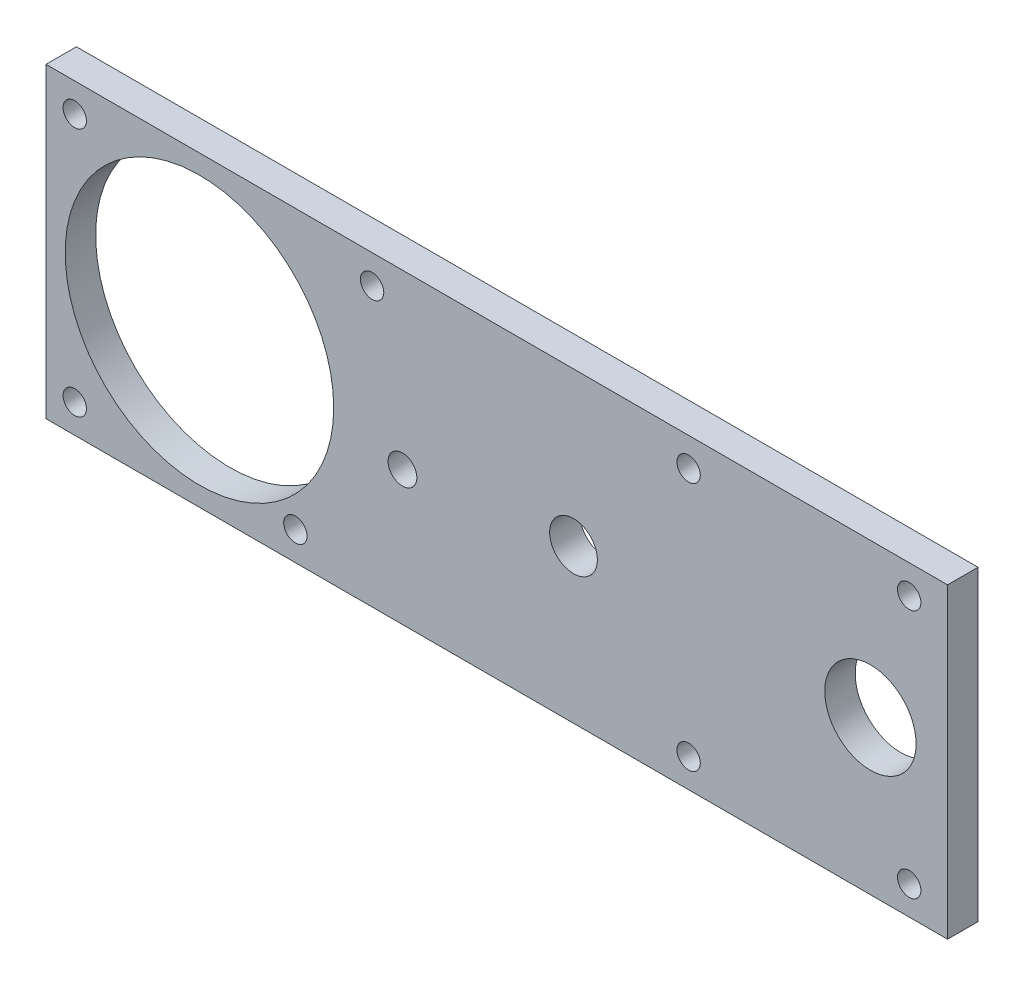
ISO-10303-21;
HEADER;
FILE_DESCRIPTION(('STEP AP214'),'2;1');
FILE_NAME('part.step','',(''),(''),'','','');
FILE_SCHEMA(('AUTOMOTIVE_DESIGN { 1 0 10303 214 1 1 1 1 }'));
ENDSEC;
DATA;
#1=APPLICATION_CONTEXT('core data for automotive mechanical design processes');
#2=APPLICATION_PROTOCOL_DEFINITION('international standard','automotive_design',2000,#1);
#3=PRODUCT_CONTEXT('',#1,'mechanical');
#4=PRODUCT('Part','Part','',(#3));
#5=PRODUCT_RELATED_PRODUCT_CATEGORY('part','',(#4));
#6=PRODUCT_DEFINITION_FORMATION('','',#4);
#7=PRODUCT_DEFINITION_CONTEXT('part definition',#1,'design');
#8=PRODUCT_DEFINITION('design','',#6,#7);
#9=PRODUCT_DEFINITION_SHAPE('','',#8);
#10=(LENGTH_UNIT() NAMED_UNIT(*) SI_UNIT(.MILLI.,.METRE.));
#11=(NAMED_UNIT(*) PLANE_ANGLE_UNIT() SI_UNIT($,.RADIAN.));
#12=(NAMED_UNIT(*) SI_UNIT($,.STERADIAN.) SOLID_ANGLE_UNIT());
#13=UNCERTAINTY_MEASURE_WITH_UNIT(LENGTH_MEASURE(1.E-05),#10,'distance_accuracy_value','');
#14=(GEOMETRIC_REPRESENTATION_CONTEXT(3) GLOBAL_UNCERTAINTY_ASSIGNED_CONTEXT((#13)) GLOBAL_UNIT_ASSIGNED_CONTEXT((#10,
#11,#12)) REPRESENTATION_CONTEXT('',''));
#15=CARTESIAN_POINT('',(0.,0.,0.));
#16=DIRECTION('',(0.,0.,1.));
#17=DIRECTION('',(1.,0.,0.));
#18=AXIS2_PLACEMENT_3D('',#15,#16,#17);
#19=CARTESIAN_POINT('',(0.,0.,3.175));
#20=DIRECTION('',(0.,0.,-1.));
#21=DIRECTION('',(-1.,0.,0.));
#22=AXIS2_PLACEMENT_3D('',#19,#20,#21);
#23=PLANE('',#22);
#24=CARTESIAN_POINT('',(85.9562,16.,3.175));
#25=DIRECTION('',(0.,0.,1.));
#26=DIRECTION('',(1.,0.,0.));
#27=AXIS2_PLACEMENT_3D('',#24,#25,#26);
#28=CIRCLE('',#27,4.7625);
#29=CARTESIAN_POINT('',(90.7187,16.,3.175));
#30=VERTEX_POINT('',#29);
#31=EDGE_CURVE('E178',#30,#30,#28,.T.);
#32=ORIENTED_EDGE('',*,*,#31,.F.);
#33=EDGE_LOOP('',(#32));
#34=FACE_BOUND('',#33,.T.);
#35=CARTESIAN_POINT('',(90.,3.,3.175));
#36=DIRECTION('',(0.,0.,1.));
#37=DIRECTION('',(1.,0.,0.));
#38=AXIS2_PLACEMENT_3D('',#35,#36,#37);
#39=CIRCLE('',#38,1.2192);
#40=CARTESIAN_POINT('',(91.2192,3.,3.175));
#41=VERTEX_POINT('',#40);
#42=EDGE_CURVE('E174',#41,#41,#39,.T.);
#43=ORIENTED_EDGE('',*,*,#42,.F.);
#44=EDGE_LOOP('',(#43));
#45=FACE_BOUND('',#44,.T.);
#46=CARTESIAN_POINT('',(90.,29.,3.175));
#47=DIRECTION('',(0.,0.,1.));
#48=DIRECTION('',(1.,0.,0.));
#49=AXIS2_PLACEMENT_3D('',#46,#47,#48);
#50=CIRCLE('',#49,1.2192);
#51=CARTESIAN_POINT('',(91.2192,29.,3.175));
#52=VERTEX_POINT('',#51);
#53=EDGE_CURVE('E168',#52,#52,#50,.T.);
#54=ORIENTED_EDGE('',*,*,#53,.F.);
#55=EDGE_LOOP('',(#54));
#56=FACE_BOUND('',#55,.T.);
#57=CARTESIAN_POINT('',(3.,29.,3.175));
#58=DIRECTION('',(0.,0.,1.));
#59=DIRECTION('',(1.,0.,0.));
#60=AXIS2_PLACEMENT_3D('',#57,#58,#59);
#61=CIRCLE('',#60,1.2192);
#62=CARTESIAN_POINT('',(4.2192,29.,3.175));
#63=VERTEX_POINT('',#62);
#64=EDGE_CURVE('E162',#63,#63,#61,.T.);
#65=ORIENTED_EDGE('',*,*,#64,.F.);
#66=EDGE_LOOP('',(#65));
#67=FACE_BOUND('',#66,.T.);
#68=CARTESIAN_POINT('',(3.,3.,3.175));
#69=DIRECTION('',(0.,0.,1.));
#70=DIRECTION('',(1.,0.,0.));
#71=AXIS2_PLACEMENT_3D('',#68,#69,#70);
#72=CIRCLE('',#71,1.2192);
#73=CARTESIAN_POINT('',(4.2192,3.,3.175));
#74=VERTEX_POINT('',#73);
#75=EDGE_CURVE('E156',#74,#74,#72,.T.);
#76=ORIENTED_EDGE('',*,*,#75,.F.);
#77=EDGE_LOOP('',(#76));
#78=FACE_BOUND('',#77,.T.);
#79=CARTESIAN_POINT('',(34.,29.,3.175));
#80=DIRECTION('',(0.,0.,1.));
#81=DIRECTION('',(1.,0.,0.));
#82=AXIS2_PLACEMENT_3D('',#79,#80,#81);
#83=CIRCLE('',#82,1.2192);
#84=CARTESIAN_POINT('',(35.2192,29.,3.175));
#85=VERTEX_POINT('',#84);
#86=EDGE_CURVE('E150',#85,#85,#83,.T.);
#87=ORIENTED_EDGE('',*,*,#86,.F.);
#88=EDGE_LOOP('',(#87));
#89=FACE_BOUND('',#88,.T.);
#90=CARTESIAN_POINT('',(26.,3.,3.175));
#91=DIRECTION('',(0.,0.,1.));
#92=DIRECTION('',(1.,0.,0.));
#93=AXIS2_PLACEMENT_3D('',#90,#91,#92);
#94=CIRCLE('',#93,1.2192);
#95=CARTESIAN_POINT('',(27.2192,3.,3.175));
#96=VERTEX_POINT('',#95);
#97=EDGE_CURVE('E144',#96,#96,#94,.T.);
#98=ORIENTED_EDGE('',*,*,#97,.F.);
#99=EDGE_LOOP('',(#98));
#100=FACE_BOUND('',#99,.T.);
#101=CARTESIAN_POINT('',(67.,3.,3.175));
#102=DIRECTION('',(0.,0.,1.));
#103=DIRECTION('',(1.,0.,0.));
#104=AXIS2_PLACEMENT_3D('',#101,#102,#103);
#105=CIRCLE('',#104,1.2192);
#106=CARTESIAN_POINT('',(68.2192,3.,3.175));
#107=VERTEX_POINT('',#106);
#108=EDGE_CURVE('E138',#107,#107,#105,.T.);
#109=ORIENTED_EDGE('',*,*,#108,.F.);
#110=EDGE_LOOP('',(#109));
#111=FACE_BOUND('',#110,.T.);
#112=CARTESIAN_POINT('',(67.,29.,3.175));
#113=DIRECTION('',(0.,0.,1.));
#114=DIRECTION('',(1.,0.,0.));
#115=AXIS2_PLACEMENT_3D('',#112,#113,#114);
#116=CIRCLE('',#115,1.2192);
#117=CARTESIAN_POINT('',(68.2192,29.,3.175));
#118=VERTEX_POINT('',#117);
#119=EDGE_CURVE('E132',#118,#118,#116,.T.);
#120=ORIENTED_EDGE('',*,*,#119,.F.);
#121=EDGE_LOOP('',(#120));
#122=FACE_BOUND('',#121,.T.);
#123=CARTESIAN_POINT('',(37.1666992956996,14.,3.175));
#124=DIRECTION('',(0.,0.,1.));
#125=DIRECTION('',(1.,0.,0.));
#126=AXIS2_PLACEMENT_3D('',#123,#124,#125);
#127=CIRCLE('',#126,1.49860000000001);
#128=CARTESIAN_POINT('',(38.6652992956997,14.,3.175));
#129=VERTEX_POINT('',#128);
#130=EDGE_CURVE('E115',#129,#129,#127,.T.);
#131=ORIENTED_EDGE('',*,*,#130,.F.);
#132=EDGE_LOOP('',(#131));
#133=FACE_BOUND('',#132,.T.);
#134=DIRECTION('',(0.,-1.,0.));
#135=VECTOR('',#134,1.);
#136=CARTESIAN_POINT('',(0.,0.,3.175));
#137=LINE('',#136,#135);
#138=CARTESIAN_POINT('',(0.,32.,3.175));
#139=VERTEX_POINT('',#138);
#140=CARTESIAN_POINT('',(0.,0.,3.175));
#141=VERTEX_POINT('',#140);
#142=EDGE_CURVE('E85',#139,#141,#137,.T.);
#143=ORIENTED_EDGE('',*,*,#142,.T.);
#144=DIRECTION('',(1.,0.,0.));
#145=VECTOR('',#144,1.);
#146=CARTESIAN_POINT('',(0.,0.,3.175));
#147=LINE('',#146,#145);
#148=CARTESIAN_POINT('',(93.9999999599999,0.,3.175));
#149=VERTEX_POINT('',#148);
#150=EDGE_CURVE('E80',#141,#149,#147,.T.);
#151=ORIENTED_EDGE('',*,*,#150,.T.);
#152=DIRECTION('',(0.,1.,0.));
#153=VECTOR('',#152,1.);
#154=CARTESIAN_POINT('',(93.9999999599999,0.,3.175));
#155=LINE('',#154,#153);
#156=CARTESIAN_POINT('',(93.9999999599999,32.,3.175));
#157=VERTEX_POINT('',#156);
#158=EDGE_CURVE('E83',#149,#157,#155,.T.);
#159=ORIENTED_EDGE('',*,*,#158,.T.);
#160=DIRECTION('',(-1.,0.,0.));
#161=VECTOR('',#160,1.);
#162=CARTESIAN_POINT('',(0.,32.,3.175));
#163=LINE('',#162,#161);
#164=EDGE_CURVE('E50',#157,#139,#163,.T.);
#165=ORIENTED_EDGE('',*,*,#164,.T.);
#166=EDGE_LOOP('',(#143,#151,#159,#165));
#167=FACE_BOUND('',#166,.T.);
#168=CARTESIAN_POINT('',(55.,16.,3.175));
#169=DIRECTION('',(0.,0.,1.));
#170=DIRECTION('',(1.,0.,0.));
#171=AXIS2_PLACEMENT_3D('',#168,#169,#170);
#172=CIRCLE('',#171,2.4892);
#173=CARTESIAN_POINT('',(57.4892,16.,3.175));
#174=VERTEX_POINT('',#173);
#175=EDGE_CURVE('E100',#174,#174,#172,.T.);
#176=ORIENTED_EDGE('',*,*,#175,.F.);
#177=EDGE_LOOP('',(#176));
#178=FACE_BOUND('',#177,.T.);
#179=CARTESIAN_POINT('',(16.,16.,3.175));
#180=DIRECTION('',(0.,0.,1.));
#181=DIRECTION('',(1.,0.,0.));
#182=AXIS2_PLACEMENT_3D('',#179,#180,#181);
#183=CIRCLE('',#182,14.);
#184=CARTESIAN_POINT('',(30.,16.,3.175));
#185=VERTEX_POINT('',#184);
#186=EDGE_CURVE('E121',#185,#185,#183,.T.);
#187=ORIENTED_EDGE('',*,*,#186,.F.);
#188=EDGE_LOOP('',(#187));
#189=FACE_BOUND('',#188,.T.);
#190=ADVANCED_FACE('F33',(#34,#45,#56,#67,#78,#89,#100,#111,#122,#133,#167,#178,#189),#23,.F.);
#191=CARTESIAN_POINT('',(0.,0.,0.));
#192=DIRECTION('',(0.,0.,-1.));
#193=DIRECTION('',(-1.,0.,0.));
#194=AXIS2_PLACEMENT_3D('',#191,#192,#193);
#195=PLANE('',#194);
#196=CARTESIAN_POINT('',(85.9562,16.,0.));
#197=DIRECTION('',(0.,0.,1.));
#198=DIRECTION('',(1.,0.,0.));
#199=AXIS2_PLACEMENT_3D('',#196,#197,#198);
#200=CIRCLE('',#199,4.7625);
#201=CARTESIAN_POINT('',(90.7187,16.,0.));
#202=VERTEX_POINT('',#201);
#203=EDGE_CURVE('E177',#202,#202,#200,.T.);
#204=ORIENTED_EDGE('',*,*,#203,.T.);
#205=EDGE_LOOP('',(#204));
#206=FACE_BOUND('',#205,.T.);
#207=CARTESIAN_POINT('',(90.,3.,0.));
#208=DIRECTION('',(0.,0.,1.));
#209=DIRECTION('',(1.,0.,0.));
#210=AXIS2_PLACEMENT_3D('',#207,#208,#209);
#211=CIRCLE('',#210,1.2192);
#212=CARTESIAN_POINT('',(91.2192,3.,0.));
#213=VERTEX_POINT('',#212);
#214=EDGE_CURVE('E171',#213,#213,#211,.T.);
#215=ORIENTED_EDGE('',*,*,#214,.T.);
#216=EDGE_LOOP('',(#215));
#217=FACE_BOUND('',#216,.T.);
#218=CARTESIAN_POINT('',(90.,29.,0.));
#219=DIRECTION('',(0.,0.,1.));
#220=DIRECTION('',(1.,0.,0.));
#221=AXIS2_PLACEMENT_3D('',#218,#219,#220);
#222=CIRCLE('',#221,1.2192);
#223=CARTESIAN_POINT('',(91.2192,29.,0.));
#224=VERTEX_POINT('',#223);
#225=EDGE_CURVE('E165',#224,#224,#222,.T.);
#226=ORIENTED_EDGE('',*,*,#225,.T.);
#227=EDGE_LOOP('',(#226));
#228=FACE_BOUND('',#227,.T.);
#229=CARTESIAN_POINT('',(3.,29.,0.));
#230=DIRECTION('',(0.,0.,1.));
#231=DIRECTION('',(1.,0.,0.));
#232=AXIS2_PLACEMENT_3D('',#229,#230,#231);
#233=CIRCLE('',#232,1.2192);
#234=CARTESIAN_POINT('',(4.2192,29.,0.));
#235=VERTEX_POINT('',#234);
#236=EDGE_CURVE('E159',#235,#235,#233,.T.);
#237=ORIENTED_EDGE('',*,*,#236,.T.);
#238=EDGE_LOOP('',(#237));
#239=FACE_BOUND('',#238,.T.);
#240=CARTESIAN_POINT('',(3.,3.,0.));
#241=DIRECTION('',(0.,0.,1.));
#242=DIRECTION('',(1.,0.,0.));
#243=AXIS2_PLACEMENT_3D('',#240,#241,#242);
#244=CIRCLE('',#243,1.2192);
#245=CARTESIAN_POINT('',(4.2192,3.,0.));
#246=VERTEX_POINT('',#245);
#247=EDGE_CURVE('E153',#246,#246,#244,.T.);
#248=ORIENTED_EDGE('',*,*,#247,.T.);
#249=EDGE_LOOP('',(#248));
#250=FACE_BOUND('',#249,.T.);
#251=CARTESIAN_POINT('',(34.,29.,0.));
#252=DIRECTION('',(0.,0.,1.));
#253=DIRECTION('',(1.,0.,0.));
#254=AXIS2_PLACEMENT_3D('',#251,#252,#253);
#255=CIRCLE('',#254,1.2192);
#256=CARTESIAN_POINT('',(35.2192,29.,0.));
#257=VERTEX_POINT('',#256);
#258=EDGE_CURVE('E147',#257,#257,#255,.T.);
#259=ORIENTED_EDGE('',*,*,#258,.T.);
#260=EDGE_LOOP('',(#259));
#261=FACE_BOUND('',#260,.T.);
#262=CARTESIAN_POINT('',(26.,3.,0.));
#263=DIRECTION('',(0.,0.,1.));
#264=DIRECTION('',(1.,0.,0.));
#265=AXIS2_PLACEMENT_3D('',#262,#263,#264);
#266=CIRCLE('',#265,1.2192);
#267=CARTESIAN_POINT('',(27.2192,3.,0.));
#268=VERTEX_POINT('',#267);
#269=EDGE_CURVE('E141',#268,#268,#266,.T.);
#270=ORIENTED_EDGE('',*,*,#269,.T.);
#271=EDGE_LOOP('',(#270));
#272=FACE_BOUND('',#271,.T.);
#273=CARTESIAN_POINT('',(67.,3.,0.));
#274=DIRECTION('',(0.,0.,1.));
#275=DIRECTION('',(1.,0.,0.));
#276=AXIS2_PLACEMENT_3D('',#273,#274,#275);
#277=CIRCLE('',#276,1.2192);
#278=CARTESIAN_POINT('',(68.2192,3.,0.));
#279=VERTEX_POINT('',#278);
#280=EDGE_CURVE('E135',#279,#279,#277,.T.);
#281=ORIENTED_EDGE('',*,*,#280,.T.);
#282=EDGE_LOOP('',(#281));
#283=FACE_BOUND('',#282,.T.);
#284=CARTESIAN_POINT('',(67.,29.,0.));
#285=DIRECTION('',(0.,0.,1.));
#286=DIRECTION('',(1.,0.,0.));
#287=AXIS2_PLACEMENT_3D('',#284,#285,#286);
#288=CIRCLE('',#287,1.2192);
#289=CARTESIAN_POINT('',(68.2192,29.,0.));
#290=VERTEX_POINT('',#289);
#291=EDGE_CURVE('E127',#290,#290,#288,.T.);
#292=ORIENTED_EDGE('',*,*,#291,.T.);
#293=EDGE_LOOP('',(#292));
#294=FACE_BOUND('',#293,.T.);
#295=CARTESIAN_POINT('',(37.1666992956996,14.,0.));
#296=DIRECTION('',(0.,0.,1.));
#297=DIRECTION('',(1.,0.,0.));
#298=AXIS2_PLACEMENT_3D('',#295,#296,#297);
#299=CIRCLE('',#298,1.49860000000001);
#300=CARTESIAN_POINT('',(38.6652992956997,14.,0.));
#301=VERTEX_POINT('',#300);
#302=EDGE_CURVE('E118',#301,#301,#299,.T.);
#303=ORIENTED_EDGE('',*,*,#302,.T.);
#304=EDGE_LOOP('',(#303));
#305=FACE_BOUND('',#304,.T.);
#306=DIRECTION('',(0.,-1.,0.));
#307=VECTOR('',#306,1.);
#308=CARTESIAN_POINT('',(0.,0.,0.));
#309=LINE('',#308,#307);
#310=CARTESIAN_POINT('',(0.,32.,0.));
#311=VERTEX_POINT('',#310);
#312=CARTESIAN_POINT('',(0.,0.,0.));
#313=VERTEX_POINT('',#312);
#314=EDGE_CURVE('E97',#311,#313,#309,.T.);
#315=ORIENTED_EDGE('',*,*,#314,.F.);
#316=DIRECTION('',(-1.,0.,0.));
#317=VECTOR('',#316,1.);
#318=CARTESIAN_POINT('',(0.,32.,0.));
#319=LINE('',#318,#317);
#320=CARTESIAN_POINT('',(93.9999999599999,32.,0.));
#321=VERTEX_POINT('',#320);
#322=EDGE_CURVE('E73',#321,#311,#319,.T.);
#323=ORIENTED_EDGE('',*,*,#322,.F.);
#324=DIRECTION('',(0.,1.,0.));
#325=VECTOR('',#324,1.);
#326=CARTESIAN_POINT('',(93.9999999599999,0.,0.));
#327=LINE('',#326,#325);
#328=CARTESIAN_POINT('',(93.9999999599999,0.,0.));
#329=VERTEX_POINT('',#328);
#330=EDGE_CURVE('E67',#329,#321,#327,.T.);
#331=ORIENTED_EDGE('',*,*,#330,.F.);
#332=DIRECTION('',(1.,0.,0.));
#333=VECTOR('',#332,1.);
#334=CARTESIAN_POINT('',(0.,0.,0.));
#335=LINE('',#334,#333);
#336=EDGE_CURVE('E89',#313,#329,#335,.T.);
#337=ORIENTED_EDGE('',*,*,#336,.F.);
#338=EDGE_LOOP('',(#315,#323,#331,#337));
#339=FACE_BOUND('',#338,.T.);
#340=CARTESIAN_POINT('',(55.,16.,0.));
#341=DIRECTION('',(0.,0.,1.));
#342=DIRECTION('',(1.,0.,0.));
#343=AXIS2_PLACEMENT_3D('',#340,#341,#342);
#344=CIRCLE('',#343,2.4892);
#345=CARTESIAN_POINT('',(57.4892,16.,0.));
#346=VERTEX_POINT('',#345);
#347=EDGE_CURVE('E112',#346,#346,#344,.T.);
#348=ORIENTED_EDGE('',*,*,#347,.T.);
#349=EDGE_LOOP('',(#348));
#350=FACE_BOUND('',#349,.T.);
#351=CARTESIAN_POINT('',(16.,16.,0.));
#352=DIRECTION('',(0.,0.,1.));
#353=DIRECTION('',(1.,0.,0.));
#354=AXIS2_PLACEMENT_3D('',#351,#352,#353);
#355=CIRCLE('',#354,14.);
#356=CARTESIAN_POINT('',(30.,16.,0.));
#357=VERTEX_POINT('',#356);
#358=EDGE_CURVE('E124',#357,#357,#355,.T.);
#359=ORIENTED_EDGE('',*,*,#358,.T.);
#360=EDGE_LOOP('',(#359));
#361=FACE_BOUND('',#360,.T.);
#362=ADVANCED_FACE('F108',(#206,#217,#228,#239,#250,#261,#272,#283,#294,#305,#339,#350,#361),
#195,.T.);
#363=CARTESIAN_POINT('',(0.,0.,3.175));
#364=DIRECTION('',(1.,0.,0.));
#365=DIRECTION('',(0.,1.,0.));
#366=AXIS2_PLACEMENT_3D('',#363,#364,#365);
#367=PLANE('',#366);
#368=ORIENTED_EDGE('',*,*,#314,.T.);
#369=DIRECTION('',(0.,0.,-1.));
#370=VECTOR('',#369,1.);
#371=CARTESIAN_POINT('',(0.,0.,3.175));
#372=LINE('',#371,#370);
#373=EDGE_CURVE('E11',#141,#313,#372,.T.);
#374=ORIENTED_EDGE('',*,*,#373,.F.);
#375=ORIENTED_EDGE('',*,*,#142,.F.);
#376=DIRECTION('',(0.,0.,-1.));
#377=VECTOR('',#376,1.);
#378=CARTESIAN_POINT('',(0.,32.,3.175));
#379=LINE('',#378,#377);
#380=EDGE_CURVE('E93',#139,#311,#379,.T.);
#381=ORIENTED_EDGE('',*,*,#380,.T.);
#382=EDGE_LOOP('',(#368,#374,#375,#381));
#383=FACE_BOUND('',#382,.T.);
#384=ADVANCED_FACE('F35',(#383),#367,.F.);
#385=CARTESIAN_POINT('',(0.,0.,3.175));
#386=DIRECTION('',(0.,1.,0.));
#387=DIRECTION('',(0.,0.,1.));
#388=AXIS2_PLACEMENT_3D('',#385,#386,#387);
#389=PLANE('',#388);
#390=ORIENTED_EDGE('',*,*,#336,.T.);
#391=DIRECTION('',(0.,0.,-1.));
#392=VECTOR('',#391,1.);
#393=CARTESIAN_POINT('',(93.9999999599999,0.,3.175));
#394=LINE('',#393,#392);
#395=EDGE_CURVE('E42',#149,#329,#394,.T.);
#396=ORIENTED_EDGE('',*,*,#395,.F.);
#397=ORIENTED_EDGE('',*,*,#150,.F.);
#398=ORIENTED_EDGE('',*,*,#373,.T.);
#399=EDGE_LOOP('',(#390,#396,#397,#398));
#400=FACE_BOUND('',#399,.T.);
#401=ADVANCED_FACE('F88',(#400),#389,.F.);
#402=CARTESIAN_POINT('',(93.9999999599999,0.,3.175));
#403=DIRECTION('',(-1.,0.,0.));
#404=DIRECTION('',(0.,0.,1.));
#405=AXIS2_PLACEMENT_3D('',#402,#403,#404);
#406=PLANE('',#405);
#407=ORIENTED_EDGE('',*,*,#330,.T.);
#408=DIRECTION('',(0.,0.,-1.));
#409=VECTOR('',#408,1.);
#410=CARTESIAN_POINT('',(93.9999999599999,32.,3.175));
#411=LINE('',#410,#409);
#412=EDGE_CURVE('E90',#157,#321,#411,.T.);
#413=ORIENTED_EDGE('',*,*,#412,.F.);
#414=ORIENTED_EDGE('',*,*,#158,.F.);
#415=ORIENTED_EDGE('',*,*,#395,.T.);
#416=EDGE_LOOP('',(#407,#413,#414,#415));
#417=FACE_BOUND('',#416,.T.);
#418=ADVANCED_FACE('F91',(#417),#406,.F.);
#419=CARTESIAN_POINT('',(0.,32.,3.175));
#420=DIRECTION('',(0.,-1.,0.));
#421=DIRECTION('',(1.,0.,0.));
#422=AXIS2_PLACEMENT_3D('',#419,#420,#421);
#423=PLANE('',#422);
#424=ORIENTED_EDGE('',*,*,#322,.T.);
#425=ORIENTED_EDGE('',*,*,#380,.F.);
#426=ORIENTED_EDGE('',*,*,#164,.F.);
#427=ORIENTED_EDGE('',*,*,#412,.T.);
#428=EDGE_LOOP('',(#424,#425,#426,#427));
#429=FACE_BOUND('',#428,.T.);
#430=ADVANCED_FACE('F105',(#429),#423,.F.);
#431=CARTESIAN_POINT('',(55.,16.,3.175));
#432=DIRECTION('',(0.,0.,-1.));
#433=DIRECTION('',(-1.,0.,0.));
#434=AXIS2_PLACEMENT_3D('',#431,#432,#433);
#435=CYLINDRICAL_SURFACE('',#434,2.4892);
#436=ORIENTED_EDGE('',*,*,#175,.T.);
#437=EDGE_LOOP('',(#436));
#438=FACE_BOUND('',#437,.T.);
#439=ORIENTED_EDGE('',*,*,#347,.F.);
#440=EDGE_LOOP('',(#439));
#441=FACE_BOUND('',#440,.T.);
#442=ADVANCED_FACE('F218',(#438,#441),#435,.F.);
#443=CARTESIAN_POINT('',(37.1666992956996,14.,3.175));
#444=DIRECTION('',(0.,0.,-1.));
#445=DIRECTION('',(-1.,0.,0.));
#446=AXIS2_PLACEMENT_3D('',#443,#444,#445);
#447=CYLINDRICAL_SURFACE('',#446,1.49860000000001);
#448=ORIENTED_EDGE('',*,*,#130,.T.);
#449=EDGE_LOOP('',(#448));
#450=FACE_BOUND('',#449,.T.);
#451=ORIENTED_EDGE('',*,*,#302,.F.);
#452=EDGE_LOOP('',(#451));
#453=FACE_BOUND('',#452,.T.);
#454=ADVANCED_FACE('F214',(#450,#453),#447,.F.);
#455=CARTESIAN_POINT('',(16.,16.,3.175));
#456=DIRECTION('',(0.,0.,-1.));
#457=DIRECTION('',(-1.,0.,0.));
#458=AXIS2_PLACEMENT_3D('',#455,#456,#457);
#459=CYLINDRICAL_SURFACE('',#458,14.);
#460=ORIENTED_EDGE('',*,*,#186,.T.);
#461=EDGE_LOOP('',(#460));
#462=FACE_BOUND('',#461,.T.);
#463=ORIENTED_EDGE('',*,*,#358,.F.);
#464=EDGE_LOOP('',(#463));
#465=FACE_BOUND('',#464,.T.);
#466=ADVANCED_FACE('F217',(#462,#465),#459,.F.);
#467=CARTESIAN_POINT('',(67.,29.,3.175));
#468=DIRECTION('',(0.,0.,1.));
#469=DIRECTION('',(1.,0.,0.));
#470=AXIS2_PLACEMENT_3D('',#467,#468,#469);
#471=CYLINDRICAL_SURFACE('',#470,1.2192);
#472=ORIENTED_EDGE('',*,*,#291,.F.);
#473=EDGE_LOOP('',(#472));
#474=FACE_BOUND('',#473,.T.);
#475=ORIENTED_EDGE('',*,*,#119,.T.);
#476=EDGE_LOOP('',(#475));
#477=FACE_BOUND('',#476,.T.);
#478=ADVANCED_FACE('F261',(#474,#477),#471,.F.);
#479=CARTESIAN_POINT('',(67.,3.,3.175));
#480=DIRECTION('',(0.,0.,1.));
#481=DIRECTION('',(1.,0.,0.));
#482=AXIS2_PLACEMENT_3D('',#479,#480,#481);
#483=CYLINDRICAL_SURFACE('',#482,1.2192);
#484=ORIENTED_EDGE('',*,*,#280,.F.);
#485=EDGE_LOOP('',(#484));
#486=FACE_BOUND('',#485,.T.);
#487=ORIENTED_EDGE('',*,*,#108,.T.);
#488=EDGE_LOOP('',(#487));
#489=FACE_BOUND('',#488,.T.);
#490=ADVANCED_FACE('F269',(#486,#489),#483,.F.);
#491=CARTESIAN_POINT('',(26.,3.,3.175));
#492=DIRECTION('',(0.,0.,1.));
#493=DIRECTION('',(1.,0.,0.));
#494=AXIS2_PLACEMENT_3D('',#491,#492,#493);
#495=CYLINDRICAL_SURFACE('',#494,1.2192);
#496=ORIENTED_EDGE('',*,*,#269,.F.);
#497=EDGE_LOOP('',(#496));
#498=FACE_BOUND('',#497,.T.);
#499=ORIENTED_EDGE('',*,*,#97,.T.);
#500=EDGE_LOOP('',(#499));
#501=FACE_BOUND('',#500,.T.);
#502=ADVANCED_FACE('F277',(#498,#501),#495,.F.);
#503=CARTESIAN_POINT('',(34.,29.,3.175));
#504=DIRECTION('',(0.,0.,1.));
#505=DIRECTION('',(1.,0.,0.));
#506=AXIS2_PLACEMENT_3D('',#503,#504,#505);
#507=CYLINDRICAL_SURFACE('',#506,1.2192);
#508=ORIENTED_EDGE('',*,*,#258,.F.);
#509=EDGE_LOOP('',(#508));
#510=FACE_BOUND('',#509,.T.);
#511=ORIENTED_EDGE('',*,*,#86,.T.);
#512=EDGE_LOOP('',(#511));
#513=FACE_BOUND('',#512,.T.);
#514=ADVANCED_FACE('F285',(#510,#513),#507,.F.);
#515=CARTESIAN_POINT('',(3.,3.,3.175));
#516=DIRECTION('',(0.,0.,1.));
#517=DIRECTION('',(1.,0.,0.));
#518=AXIS2_PLACEMENT_3D('',#515,#516,#517);
#519=CYLINDRICAL_SURFACE('',#518,1.2192);
#520=ORIENTED_EDGE('',*,*,#247,.F.);
#521=EDGE_LOOP('',(#520));
#522=FACE_BOUND('',#521,.T.);
#523=ORIENTED_EDGE('',*,*,#75,.T.);
#524=EDGE_LOOP('',(#523));
#525=FACE_BOUND('',#524,.T.);
#526=ADVANCED_FACE('F293',(#522,#525),#519,.F.);
#527=CARTESIAN_POINT('',(3.,29.,3.175));
#528=DIRECTION('',(0.,0.,1.));
#529=DIRECTION('',(1.,0.,0.));
#530=AXIS2_PLACEMENT_3D('',#527,#528,#529);
#531=CYLINDRICAL_SURFACE('',#530,1.2192);
#532=ORIENTED_EDGE('',*,*,#236,.F.);
#533=EDGE_LOOP('',(#532));
#534=FACE_BOUND('',#533,.T.);
#535=ORIENTED_EDGE('',*,*,#64,.T.);
#536=EDGE_LOOP('',(#535));
#537=FACE_BOUND('',#536,.T.);
#538=ADVANCED_FACE('F301',(#534,#537),#531,.F.);
#539=CARTESIAN_POINT('',(90.,29.,3.175));
#540=DIRECTION('',(0.,0.,1.));
#541=DIRECTION('',(1.,0.,0.));
#542=AXIS2_PLACEMENT_3D('',#539,#540,#541);
#543=CYLINDRICAL_SURFACE('',#542,1.2192);
#544=ORIENTED_EDGE('',*,*,#225,.F.);
#545=EDGE_LOOP('',(#544));
#546=FACE_BOUND('',#545,.T.);
#547=ORIENTED_EDGE('',*,*,#53,.T.);
#548=EDGE_LOOP('',(#547));
#549=FACE_BOUND('',#548,.T.);
#550=ADVANCED_FACE('F309',(#546,#549),#543,.F.);
#551=CARTESIAN_POINT('',(90.,3.,3.175));
#552=DIRECTION('',(0.,0.,1.));
#553=DIRECTION('',(1.,0.,0.));
#554=AXIS2_PLACEMENT_3D('',#551,#552,#553);
#555=CYLINDRICAL_SURFACE('',#554,1.2192);
#556=ORIENTED_EDGE('',*,*,#214,.F.);
#557=EDGE_LOOP('',(#556));
#558=FACE_BOUND('',#557,.T.);
#559=ORIENTED_EDGE('',*,*,#42,.T.);
#560=EDGE_LOOP('',(#559));
#561=FACE_BOUND('',#560,.T.);
#562=ADVANCED_FACE('F189',(#558,#561),#555,.F.);
#563=CARTESIAN_POINT('',(85.9562,16.,0.));
#564=DIRECTION('',(0.,0.,1.));
#565=DIRECTION('',(1.,0.,0.));
#566=AXIS2_PLACEMENT_3D('',#563,#564,#565);
#567=CYLINDRICAL_SURFACE('',#566,4.7625);
#568=ORIENTED_EDGE('',*,*,#203,.F.);
#569=EDGE_LOOP('',(#568));
#570=FACE_BOUND('',#569,.T.);
#571=ORIENTED_EDGE('',*,*,#31,.T.);
#572=EDGE_LOOP('',(#571));
#573=FACE_BOUND('',#572,.T.);
#574=ADVANCED_FACE('F186',(#570,#573),#567,.F.);
#575=CLOSED_SHELL('',(#190,#362,#384,#401,#418,#430,#442,#454,#466,#478,#490,#502,#514,#526,
#538,#550,#562,#574));
#576=MANIFOLD_SOLID_BREP('B2',#575);
#577=ADVANCED_BREP_SHAPE_REPRESENTATION('',(#18,#576),#14);
#578=SHAPE_DEFINITION_REPRESENTATION(#9,#577);
ENDSEC;
END-ISO-10303-21;
